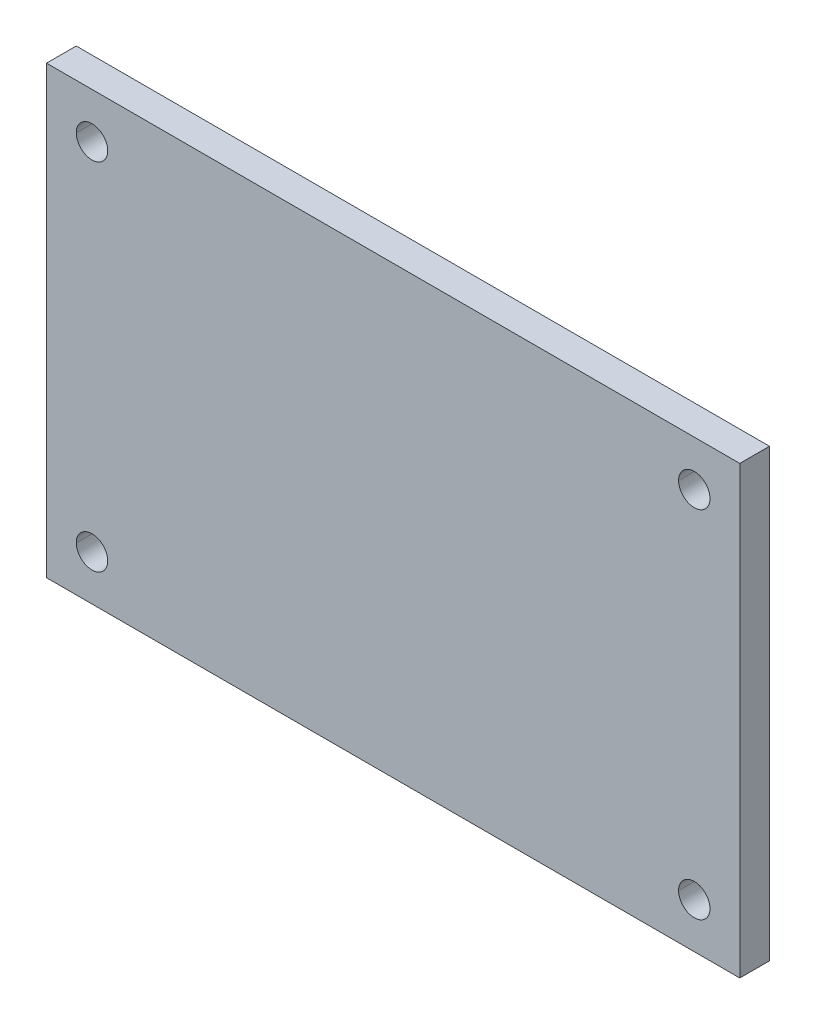
ISO-10303-21;
HEADER;
FILE_DESCRIPTION(('STEP AP214'),'2;1');
FILE_NAME('part.step','',(''),(''),'','','');
FILE_SCHEMA(('AUTOMOTIVE_DESIGN { 1 0 10303 214 1 1 1 1 }'));
ENDSEC;
DATA;
#1=APPLICATION_CONTEXT('core data for automotive mechanical design processes');
#2=APPLICATION_PROTOCOL_DEFINITION('international standard','automotive_design',2000,#1);
#3=PRODUCT_CONTEXT('',#1,'mechanical');
#4=PRODUCT('Part','Part','',(#3));
#5=PRODUCT_RELATED_PRODUCT_CATEGORY('part','',(#4));
#6=PRODUCT_DEFINITION_FORMATION('','',#4);
#7=PRODUCT_DEFINITION_CONTEXT('part definition',#1,'design');
#8=PRODUCT_DEFINITION('design','',#6,#7);
#9=PRODUCT_DEFINITION_SHAPE('','',#8);
#10=(LENGTH_UNIT() NAMED_UNIT(*) SI_UNIT(.MILLI.,.METRE.));
#11=(NAMED_UNIT(*) PLANE_ANGLE_UNIT() SI_UNIT($,.RADIAN.));
#12=(NAMED_UNIT(*) SI_UNIT($,.STERADIAN.) SOLID_ANGLE_UNIT());
#13=UNCERTAINTY_MEASURE_WITH_UNIT(LENGTH_MEASURE(1.E-05),#10,'distance_accuracy_value','');
#14=(GEOMETRIC_REPRESENTATION_CONTEXT(3) GLOBAL_UNCERTAINTY_ASSIGNED_CONTEXT((#13)) GLOBAL_UNIT_ASSIGNED_CONTEXT((#10,
#11,#12)) REPRESENTATION_CONTEXT('',''));
#15=CARTESIAN_POINT('',(0.,0.,0.));
#16=DIRECTION('',(0.,0.,1.));
#17=DIRECTION('',(1.,0.,0.));
#18=AXIS2_PLACEMENT_3D('',#15,#16,#17);
#19=CARTESIAN_POINT('',(35.,0.,-10.));
#20=DIRECTION('',(-1.,0.,0.));
#21=DIRECTION('',(0.,0.,1.));
#22=AXIS2_PLACEMENT_3D('',#19,#20,#21);
#23=CYLINDRICAL_SURFACE('',#22,1.7);
#24=CARTESIAN_POINT('',(3.,0.,-10.));
#25=DIRECTION('',(1.,0.,0.));
#26=DIRECTION('',(0.,0.,-1.));
#27=AXIS2_PLACEMENT_3D('',#24,#25,#26);
#28=CIRCLE('',#27,1.7);
#29=CARTESIAN_POINT('',(3.,0.,-11.7));
#30=VERTEX_POINT('',#29);
#31=EDGE_CURVE('E272',#30,#30,#28,.T.);
#32=ORIENTED_EDGE('',*,*,#31,.T.);
#33=EDGE_LOOP('',(#32));
#34=FACE_BOUND('',#33,.T.);
#35=CARTESIAN_POINT('',(0.,0.,-10.));
#36=DIRECTION('',(-1.,0.,0.));
#37=DIRECTION('',(0.,0.,1.));
#38=AXIS2_PLACEMENT_3D('',#35,#36,#37);
#39=CIRCLE('',#38,1.7);
#40=CARTESIAN_POINT('',(0.,0.,-8.3));
#41=VERTEX_POINT('',#40);
#42=EDGE_CURVE('E44',#41,#41,#39,.F.);
#43=ORIENTED_EDGE('',*,*,#42,.F.);
#44=EDGE_LOOP('',(#43));
#45=FACE_BOUND('',#44,.T.);
#46=ADVANCED_FACE('F40',(#34,#45),#23,.F.);
#47=CARTESIAN_POINT('',(0.,0.,0.));
#48=DIRECTION('',(0.,0.,1.));
#49=DIRECTION('',(1.,0.,0.));
#50=AXIS2_PLACEMENT_3D('',#47,#48,#49);
#51=PLANE('',#50);
#52=DIRECTION('',(0.,1.,0.));
#53=VECTOR('',#52,1.);
#54=CARTESIAN_POINT('',(35.,-22.5,0.));
#55=LINE('',#54,#53);
#56=CARTESIAN_POINT('',(35.,-22.5,0.));
#57=VERTEX_POINT('',#56);
#58=CARTESIAN_POINT('',(35.,22.5,0.));
#59=VERTEX_POINT('',#58);
#60=EDGE_CURVE('E175',#57,#59,#55,.T.);
#61=ORIENTED_EDGE('',*,*,#60,.F.);
#62=DIRECTION('',(1.,0.,0.));
#63=VECTOR('',#62,1.);
#64=CARTESIAN_POINT('',(35.,-22.5,0.));
#65=LINE('',#64,#63);
#66=CARTESIAN_POINT('',(-35.,-22.5,0.));
#67=VERTEX_POINT('',#66);
#68=EDGE_CURVE('E184',#67,#57,#65,.T.);
#69=ORIENTED_EDGE('',*,*,#68,.F.);
#70=DIRECTION('',(0.,-1.,0.));
#71=VECTOR('',#70,1.);
#72=CARTESIAN_POINT('',(-35.,-22.5,0.));
#73=LINE('',#72,#71);
#74=CARTESIAN_POINT('',(-35.,22.5,0.));
#75=VERTEX_POINT('',#74);
#76=EDGE_CURVE('E190',#75,#67,#73,.T.);
#77=ORIENTED_EDGE('',*,*,#76,.F.);
#78=DIRECTION('',(-1.,0.,0.));
#79=VECTOR('',#78,1.);
#80=CARTESIAN_POINT('',(35.,22.5,0.));
#81=LINE('',#80,#79);
#82=EDGE_CURVE('E195',#59,#75,#81,.T.);
#83=ORIENTED_EDGE('',*,*,#82,.F.);
#84=EDGE_LOOP('',(#61,#69,#77,#83));
#85=FACE_BOUND('',#84,.T.);
#86=CARTESIAN_POINT('',(30.4078282956525,-17.94069088138,0.));
#87=DIRECTION('',(0.,0.,1.));
#88=DIRECTION('',(1.,0.,0.));
#89=AXIS2_PLACEMENT_3D('',#86,#87,#88);
#90=CIRCLE('',#89,1.58750520701328);
#91=CARTESIAN_POINT('',(28.8203230886392,-17.94069088138,0.));
#92=VERTEX_POINT('',#91);
#93=CARTESIAN_POINT('',(31.9953335026658,-17.94069088138,0.));
#94=VERTEX_POINT('',#93);
#95=EDGE_CURVE('E212',#92,#94,#90,.T.);
#96=ORIENTED_EDGE('',*,*,#95,.T.);
#97=CARTESIAN_POINT('',(30.4078282956525,-17.94069088138,0.));
#98=DIRECTION('',(0.,0.,1.));
#99=DIRECTION('',(1.,0.,0.));
#100=AXIS2_PLACEMENT_3D('',#97,#98,#99);
#101=CIRCLE('',#100,1.58750520701328);
#102=EDGE_CURVE('E225',#94,#92,#101,.T.);
#103=ORIENTED_EDGE('',*,*,#102,.T.);
#104=EDGE_LOOP('',(#96,#103));
#105=FACE_BOUND('',#104,.T.);
#106=CARTESIAN_POINT('',(30.4078282956525,17.91656083312,0.));
#107=DIRECTION('',(0.,0.,1.));
#108=DIRECTION('',(1.,0.,0.));
#109=AXIS2_PLACEMENT_3D('',#106,#107,#108);
#110=CIRCLE('',#109,1.58750520701328);
#111=CARTESIAN_POINT('',(28.8203230886392,17.91656083312,0.));
#112=VERTEX_POINT('',#111);
#113=CARTESIAN_POINT('',(31.9953335026658,17.91656083312,0.));
#114=VERTEX_POINT('',#113);
#115=EDGE_CURVE('E243',#112,#114,#110,.T.);
#116=ORIENTED_EDGE('',*,*,#115,.T.);
#117=CARTESIAN_POINT('',(30.4078282956525,17.91656083312,0.));
#118=DIRECTION('',(0.,0.,1.));
#119=DIRECTION('',(1.,0.,0.));
#120=AXIS2_PLACEMENT_3D('',#117,#118,#119);
#121=CIRCLE('',#120,1.58750520701328);
#122=EDGE_CURVE('E221',#114,#112,#121,.T.);
#123=ORIENTED_EDGE('',*,*,#122,.T.);
#124=EDGE_LOOP('',(#116,#123));
#125=FACE_BOUND('',#124,.T.);
#126=CARTESIAN_POINT('',(-30.4078282956525,-17.94069088138,0.));
#127=DIRECTION('',(0.,0.,1.));
#128=DIRECTION('',(-1.,0.,0.));
#129=AXIS2_PLACEMENT_3D('',#126,#127,#128);
#130=CIRCLE('',#129,1.58750520701333);
#131=CARTESIAN_POINT('',(-31.9953335026658,-17.94069088138,0.));
#132=VERTEX_POINT('',#131);
#133=CARTESIAN_POINT('',(-28.8203230886392,-17.94069088138,0.));
#134=VERTEX_POINT('',#133);
#135=EDGE_CURVE('E214',#132,#134,#130,.T.);
#136=ORIENTED_EDGE('',*,*,#135,.T.);
#137=CARTESIAN_POINT('',(-30.4078282956525,-17.94069088138,0.));
#138=DIRECTION('',(0.,0.,1.));
#139=DIRECTION('',(-1.,0.,0.));
#140=AXIS2_PLACEMENT_3D('',#137,#138,#139);
#141=CIRCLE('',#140,1.58750520701333);
#142=EDGE_CURVE('E154',#134,#132,#141,.T.);
#143=ORIENTED_EDGE('',*,*,#142,.T.);
#144=EDGE_LOOP('',(#136,#143));
#145=FACE_BOUND('',#144,.T.);
#146=CARTESIAN_POINT('',(-30.4078282956525,17.91656083312,0.));
#147=DIRECTION('',(0.,0.,1.));
#148=DIRECTION('',(-1.,0.,0.));
#149=AXIS2_PLACEMENT_3D('',#146,#147,#148);
#150=CIRCLE('',#149,1.58750520701334);
#151=CARTESIAN_POINT('',(-31.9953335026658,17.91656083312,0.));
#152=VERTEX_POINT('',#151);
#153=CARTESIAN_POINT('',(-28.8203230886392,17.91656083312,0.));
#154=VERTEX_POINT('',#153);
#155=EDGE_CURVE('E253',#152,#154,#150,.T.);
#156=ORIENTED_EDGE('',*,*,#155,.T.);
#157=CARTESIAN_POINT('',(-30.4078282956525,17.91656083312,0.));
#158=DIRECTION('',(0.,0.,1.));
#159=DIRECTION('',(-1.,0.,0.));
#160=AXIS2_PLACEMENT_3D('',#157,#158,#159);
#161=CIRCLE('',#160,1.58750520701334);
#162=EDGE_CURVE('E220',#154,#152,#161,.T.);
#163=ORIENTED_EDGE('',*,*,#162,.T.);
#164=EDGE_LOOP('',(#156,#163));
#165=FACE_BOUND('',#164,.T.);
#166=DIRECTION('',(0.,-1.,0.));
#167=VECTOR('',#166,1.);
#168=CARTESIAN_POINT('',(-3.,-291575.25,0.));
#169=LINE('',#168,#167);
#170=CARTESIAN_POINT('',(-3.,9.99999999993406,0.));
#171=VERTEX_POINT('',#170);
#172=CARTESIAN_POINT('',(-3.,-9.99999999993406,-2.27373675443232E-10));
#173=VERTEX_POINT('',#172);
#174=EDGE_CURVE('E293',#171,#173,#169,.T.);
#175=ORIENTED_EDGE('',*,*,#174,.T.);
#176=DIRECTION('',(1.,0.,0.));
#177=VECTOR('',#176,1.);
#178=CARTESIAN_POINT('',(-3.,-9.99999999993406,-2.27373675443232E-10));
#179=LINE('',#178,#177);
#180=CARTESIAN_POINT('',(3.,-9.99999999993406,-2.27373675443232E-10));
#181=VERTEX_POINT('',#180);
#182=EDGE_CURVE('E315',#173,#181,#179,.T.);
#183=ORIENTED_EDGE('',*,*,#182,.T.);
#184=DIRECTION('',(0.,-1.,0.));
#185=VECTOR('',#184,1.);
#186=CARTESIAN_POINT('',(3.,-291575.25,0.));
#187=LINE('',#186,#185);
#188=CARTESIAN_POINT('',(3.,9.99999999991985,0.));
#189=VERTEX_POINT('',#188);
#190=EDGE_CURVE('E276',#189,#181,#187,.T.);
#191=ORIENTED_EDGE('',*,*,#190,.F.);
#192=DIRECTION('',(1.,0.,0.));
#193=VECTOR('',#192,1.);
#194=CARTESIAN_POINT('',(-3.,9.99999999993406,0.));
#195=LINE('',#194,#193);
#196=EDGE_CURVE('E302',#171,#189,#195,.T.);
#197=ORIENTED_EDGE('',*,*,#196,.F.);
#198=EDGE_LOOP('',(#175,#183,#191,#197));
#199=FACE_BOUND('',#198,.T.);
#200=ADVANCED_FACE('F193',(#85,#105,#125,#145,#165,#199),#51,.F.);
#201=CARTESIAN_POINT('',(-30.4078282956525,-17.94069088138,3.));
#202=DIRECTION('',(0.,0.,-1.));
#203=DIRECTION('',(-1.,0.,0.));
#204=AXIS2_PLACEMENT_3D('',#201,#202,#203);
#205=CYLINDRICAL_SURFACE('',#204,1.58750520701333);
#206=DIRECTION('',(0.,0.,-1.));
#207=VECTOR('',#206,1.);
#208=CARTESIAN_POINT('',(-28.8203230886392,-17.94069088138,3.));
#209=LINE('',#208,#207);
#210=CARTESIAN_POINT('',(-28.8203230886392,-17.94069088138,3.));
#211=VERTEX_POINT('',#210);
#212=EDGE_CURVE('E218',#211,#134,#209,.T.);
#213=ORIENTED_EDGE('',*,*,#212,.F.);
#214=CARTESIAN_POINT('',(-30.4078282956525,-17.94069088138,3.));
#215=DIRECTION('',(0.,0.,1.));
#216=DIRECTION('',(-1.,0.,0.));
#217=AXIS2_PLACEMENT_3D('',#214,#215,#216);
#218=CIRCLE('',#217,1.58750520701333);
#219=CARTESIAN_POINT('',(-31.9953335026658,-17.94069088138,3.));
#220=VERTEX_POINT('',#219);
#221=EDGE_CURVE('E197',#211,#220,#218,.T.);
#222=ORIENTED_EDGE('',*,*,#221,.T.);
#223=DIRECTION('',(0.,0.,-1.));
#224=VECTOR('',#223,1.);
#225=CARTESIAN_POINT('',(-31.9953335026658,-17.94069088138,3.));
#226=LINE('',#225,#224);
#227=EDGE_CURVE('E217',#220,#132,#226,.T.);
#228=ORIENTED_EDGE('',*,*,#227,.T.);
#229=ORIENTED_EDGE('',*,*,#142,.F.);
#230=EDGE_LOOP('',(#213,#222,#228,#229));
#231=FACE_BOUND('',#230,.T.);
#232=ADVANCED_FACE('F361',(#231),#205,.F.);
#233=CARTESIAN_POINT('',(-30.4078282956525,17.91656083312,3.));
#234=DIRECTION('',(0.,0.,-1.));
#235=DIRECTION('',(-1.,0.,0.));
#236=AXIS2_PLACEMENT_3D('',#233,#234,#235);
#237=CYLINDRICAL_SURFACE('',#236,1.58750520701334);
#238=DIRECTION('',(0.,0.,-1.));
#239=VECTOR('',#238,1.);
#240=CARTESIAN_POINT('',(-28.8203230886392,17.91656083312,3.));
#241=LINE('',#240,#239);
#242=CARTESIAN_POINT('',(-28.8203230886392,17.91656083312,3.));
#243=VERTEX_POINT('',#242);
#244=EDGE_CURVE('E257',#243,#154,#241,.T.);
#245=ORIENTED_EDGE('',*,*,#244,.F.);
#246=CARTESIAN_POINT('',(-30.4078282956525,17.91656083312,3.));
#247=DIRECTION('',(0.,0.,1.));
#248=DIRECTION('',(-1.,0.,0.));
#249=AXIS2_PLACEMENT_3D('',#246,#247,#248);
#250=CIRCLE('',#249,1.58750520701334);
#251=CARTESIAN_POINT('',(-31.9953335026658,17.91656083312,3.));
#252=VERTEX_POINT('',#251);
#253=EDGE_CURVE('E145',#243,#252,#250,.T.);
#254=ORIENTED_EDGE('',*,*,#253,.T.);
#255=DIRECTION('',(0.,0.,-1.));
#256=VECTOR('',#255,1.);
#257=CARTESIAN_POINT('',(-31.9953335026658,17.91656083312,3.));
#258=LINE('',#257,#256);
#259=EDGE_CURVE('E207',#252,#152,#258,.T.);
#260=ORIENTED_EDGE('',*,*,#259,.T.);
#261=ORIENTED_EDGE('',*,*,#162,.F.);
#262=EDGE_LOOP('',(#245,#254,#260,#261));
#263=FACE_BOUND('',#262,.T.);
#264=ADVANCED_FACE('F354',(#263),#237,.F.);
#265=CARTESIAN_POINT('',(30.4078282956525,17.91656083312,3.));
#266=DIRECTION('',(0.,0.,-1.));
#267=DIRECTION('',(-1.,0.,0.));
#268=AXIS2_PLACEMENT_3D('',#265,#266,#267);
#269=CYLINDRICAL_SURFACE('',#268,1.58750520701329);
#270=DIRECTION('',(0.,0.,-1.));
#271=VECTOR('',#270,1.);
#272=CARTESIAN_POINT('',(31.9953335026658,17.91656083312,3.));
#273=LINE('',#272,#271);
#274=CARTESIAN_POINT('',(31.9953335026658,17.91656083312,3.));
#275=VERTEX_POINT('',#274);
#276=EDGE_CURVE('E240',#275,#114,#273,.T.);
#277=ORIENTED_EDGE('',*,*,#276,.F.);
#278=CARTESIAN_POINT('',(30.4078282956525,17.91656083312,3.));
#279=DIRECTION('',(0.,0.,1.));
#280=DIRECTION('',(1.,0.,0.));
#281=AXIS2_PLACEMENT_3D('',#278,#279,#280);
#282=CIRCLE('',#281,1.58750520701328);
#283=CARTESIAN_POINT('',(28.8203230886392,17.91656083312,3.));
#284=VERTEX_POINT('',#283);
#285=EDGE_CURVE('E203',#275,#284,#282,.T.);
#286=ORIENTED_EDGE('',*,*,#285,.T.);
#287=DIRECTION('',(0.,0.,-1.));
#288=VECTOR('',#287,1.);
#289=CARTESIAN_POINT('',(28.8203230886392,17.91656083312,3.));
#290=LINE('',#289,#288);
#291=EDGE_CURVE('E247',#284,#112,#290,.T.);
#292=ORIENTED_EDGE('',*,*,#291,.T.);
#293=ORIENTED_EDGE('',*,*,#122,.F.);
#294=EDGE_LOOP('',(#277,#286,#292,#293));
#295=FACE_BOUND('',#294,.T.);
#296=ADVANCED_FACE('F465',(#295),#269,.F.);
#297=CARTESIAN_POINT('',(30.4078282956525,-17.94069088138,3.));
#298=DIRECTION('',(0.,0.,-1.));
#299=DIRECTION('',(-1.,0.,0.));
#300=AXIS2_PLACEMENT_3D('',#297,#298,#299);
#301=CYLINDRICAL_SURFACE('',#300,1.58750520701328);
#302=DIRECTION('',(0.,0.,-1.));
#303=VECTOR('',#302,1.);
#304=CARTESIAN_POINT('',(31.9953335026658,-17.94069088138,3.));
#305=LINE('',#304,#303);
#306=CARTESIAN_POINT('',(31.9953335026658,-17.94069088138,3.));
#307=VERTEX_POINT('',#306);
#308=EDGE_CURVE('E209',#307,#94,#305,.T.);
#309=ORIENTED_EDGE('',*,*,#308,.F.);
#310=CARTESIAN_POINT('',(30.4078282956525,-17.94069088138,3.));
#311=DIRECTION('',(0.,0.,1.));
#312=DIRECTION('',(1.,0.,0.));
#313=AXIS2_PLACEMENT_3D('',#310,#311,#312);
#314=CIRCLE('',#313,1.58750520701328);
#315=CARTESIAN_POINT('',(28.8203230886392,-17.94069088138,3.));
#316=VERTEX_POINT('',#315);
#317=EDGE_CURVE('E332',#307,#316,#314,.T.);
#318=ORIENTED_EDGE('',*,*,#317,.T.);
#319=DIRECTION('',(0.,0.,-1.));
#320=VECTOR('',#319,1.);
#321=CARTESIAN_POINT('',(28.8203230886392,-17.94069088138,3.));
#322=LINE('',#321,#320);
#323=EDGE_CURVE('E264',#316,#92,#322,.T.);
#324=ORIENTED_EDGE('',*,*,#323,.T.);
#325=ORIENTED_EDGE('',*,*,#102,.F.);
#326=EDGE_LOOP('',(#309,#318,#324,#325));
#327=FACE_BOUND('',#326,.T.);
#328=ADVANCED_FACE('F399',(#327),#301,.F.);
#329=CARTESIAN_POINT('',(35.,22.5,3.));
#330=DIRECTION('',(0.,-1.,0.));
#331=DIRECTION('',(0.,0.,-1.));
#332=AXIS2_PLACEMENT_3D('',#329,#330,#331);
#333=PLANE('',#332);
#334=ORIENTED_EDGE('',*,*,#82,.T.);
#335=DIRECTION('',(0.,0.,-1.));
#336=VECTOR('',#335,1.);
#337=CARTESIAN_POINT('',(-35.,22.5,3.));
#338=LINE('',#337,#336);
#339=CARTESIAN_POINT('',(-35.,22.5,3.));
#340=VERTEX_POINT('',#339);
#341=EDGE_CURVE('E71',#340,#75,#338,.T.);
#342=ORIENTED_EDGE('',*,*,#341,.F.);
#343=DIRECTION('',(-1.,0.,0.));
#344=VECTOR('',#343,1.);
#345=CARTESIAN_POINT('',(35.,22.5,3.));
#346=LINE('',#345,#344);
#347=CARTESIAN_POINT('',(35.,22.5,3.));
#348=VERTEX_POINT('',#347);
#349=EDGE_CURVE('E230',#348,#340,#346,.T.);
#350=ORIENTED_EDGE('',*,*,#349,.F.);
#351=DIRECTION('',(0.,0.,-1.));
#352=VECTOR('',#351,1.);
#353=CARTESIAN_POINT('',(35.,22.5,3.));
#354=LINE('',#353,#352);
#355=EDGE_CURVE('E11',#348,#59,#354,.T.);
#356=ORIENTED_EDGE('',*,*,#355,.T.);
#357=EDGE_LOOP('',(#334,#342,#350,#356));
#358=FACE_BOUND('',#357,.T.);
#359=ADVANCED_FACE('F444',(#358),#333,.F.);
#360=CARTESIAN_POINT('',(35.,-22.5,3.));
#361=DIRECTION('',(-1.,0.,0.));
#362=DIRECTION('',(0.,0.,1.));
#363=AXIS2_PLACEMENT_3D('',#360,#361,#362);
#364=PLANE('',#363);
#365=ORIENTED_EDGE('',*,*,#60,.T.);
#366=ORIENTED_EDGE('',*,*,#355,.F.);
#367=DIRECTION('',(0.,1.,0.));
#368=VECTOR('',#367,1.);
#369=CARTESIAN_POINT('',(35.,-22.5,3.));
#370=LINE('',#369,#368);
#371=CARTESIAN_POINT('',(35.,-22.5,3.));
#372=VERTEX_POINT('',#371);
#373=EDGE_CURVE('E177',#372,#348,#370,.T.);
#374=ORIENTED_EDGE('',*,*,#373,.F.);
#375=DIRECTION('',(0.,0.,-1.));
#376=VECTOR('',#375,1.);
#377=CARTESIAN_POINT('',(35.,-22.5,3.));
#378=LINE('',#377,#376);
#379=EDGE_CURVE('E50',#372,#57,#378,.T.);
#380=ORIENTED_EDGE('',*,*,#379,.T.);
#381=EDGE_LOOP('',(#365,#366,#374,#380));
#382=FACE_BOUND('',#381,.T.);
#383=ADVANCED_FACE('F173',(#382),#364,.F.);
#384=CARTESIAN_POINT('',(35.,-22.5,3.));
#385=DIRECTION('',(0.,1.,0.));
#386=DIRECTION('',(1.,0.,0.));
#387=AXIS2_PLACEMENT_3D('',#384,#385,#386);
#388=PLANE('',#387);
#389=ORIENTED_EDGE('',*,*,#68,.T.);
#390=ORIENTED_EDGE('',*,*,#379,.F.);
#391=DIRECTION('',(1.,0.,0.));
#392=VECTOR('',#391,1.);
#393=CARTESIAN_POINT('',(35.,-22.5,3.));
#394=LINE('',#393,#392);
#395=CARTESIAN_POINT('',(-35.,-22.5,3.));
#396=VERTEX_POINT('',#395);
#397=EDGE_CURVE('E226',#396,#372,#394,.T.);
#398=ORIENTED_EDGE('',*,*,#397,.F.);
#399=DIRECTION('',(0.,0.,-1.));
#400=VECTOR('',#399,1.);
#401=CARTESIAN_POINT('',(-35.,-22.5,3.));
#402=LINE('',#401,#400);
#403=EDGE_CURVE('E186',#396,#67,#402,.T.);
#404=ORIENTED_EDGE('',*,*,#403,.T.);
#405=EDGE_LOOP('',(#389,#390,#398,#404));
#406=FACE_BOUND('',#405,.T.);
#407=ADVANCED_FACE('F42',(#406),#388,.F.);
#408=CARTESIAN_POINT('',(-35.,-22.5,3.));
#409=DIRECTION('',(1.,0.,0.));
#410=DIRECTION('',(0.,1.,0.));
#411=AXIS2_PLACEMENT_3D('',#408,#409,#410);
#412=PLANE('',#411);
#413=ORIENTED_EDGE('',*,*,#76,.T.);
#414=ORIENTED_EDGE('',*,*,#403,.F.);
#415=DIRECTION('',(0.,-1.,0.));
#416=VECTOR('',#415,1.);
#417=CARTESIAN_POINT('',(-35.,-22.5,3.));
#418=LINE('',#417,#416);
#419=EDGE_CURVE('E229',#340,#396,#418,.T.);
#420=ORIENTED_EDGE('',*,*,#419,.F.);
#421=ORIENTED_EDGE('',*,*,#341,.T.);
#422=EDGE_LOOP('',(#413,#414,#420,#421));
#423=FACE_BOUND('',#422,.T.);
#424=ADVANCED_FACE('F407',(#423),#412,.F.);
#425=CARTESIAN_POINT('',(0.,0.,3.));
#426=DIRECTION('',(0.,0.,1.));
#427=DIRECTION('',(1.,0.,0.));
#428=AXIS2_PLACEMENT_3D('',#425,#426,#427);
#429=PLANE('',#428);
#430=CARTESIAN_POINT('',(-30.4078282956525,-17.94069088138,3.));
#431=DIRECTION('',(0.,0.,1.));
#432=DIRECTION('',(-1.,0.,0.));
#433=AXIS2_PLACEMENT_3D('',#430,#431,#432);
#434=CIRCLE('',#433,1.58750520701333);
#435=EDGE_CURVE('E271',#220,#211,#434,.T.);
#436=ORIENTED_EDGE('',*,*,#435,.F.);
#437=ORIENTED_EDGE('',*,*,#221,.F.);
#438=EDGE_LOOP('',(#436,#437));
#439=FACE_BOUND('',#438,.T.);
#440=CARTESIAN_POINT('',(30.4078282956525,17.91656083312,3.));
#441=DIRECTION('',(0.,0.,1.));
#442=DIRECTION('',(1.,0.,0.));
#443=AXIS2_PLACEMENT_3D('',#440,#441,#442);
#444=CIRCLE('',#443,1.58750520701328);
#445=EDGE_CURVE('E236',#284,#275,#444,.T.);
#446=ORIENTED_EDGE('',*,*,#445,.F.);
#447=ORIENTED_EDGE('',*,*,#285,.F.);
#448=EDGE_LOOP('',(#446,#447));
#449=FACE_BOUND('',#448,.T.);
#450=CARTESIAN_POINT('',(30.4078282956525,-17.94069088138,3.));
#451=DIRECTION('',(0.,0.,1.));
#452=DIRECTION('',(1.,0.,0.));
#453=AXIS2_PLACEMENT_3D('',#450,#451,#452);
#454=CIRCLE('',#453,1.58750520701328);
#455=EDGE_CURVE('E213',#316,#307,#454,.T.);
#456=ORIENTED_EDGE('',*,*,#455,.F.);
#457=ORIENTED_EDGE('',*,*,#317,.F.);
#458=EDGE_LOOP('',(#456,#457));
#459=FACE_BOUND('',#458,.T.);
#460=CARTESIAN_POINT('',(-30.4078282956525,17.91656083312,3.));
#461=DIRECTION('',(0.,0.,1.));
#462=DIRECTION('',(-1.,0.,0.));
#463=AXIS2_PLACEMENT_3D('',#460,#461,#462);
#464=CIRCLE('',#463,1.58750520701334);
#465=EDGE_CURVE('E268',#252,#243,#464,.T.);
#466=ORIENTED_EDGE('',*,*,#465,.F.);
#467=ORIENTED_EDGE('',*,*,#253,.F.);
#468=EDGE_LOOP('',(#466,#467));
#469=FACE_BOUND('',#468,.T.);
#470=ORIENTED_EDGE('',*,*,#419,.T.);
#471=ORIENTED_EDGE('',*,*,#397,.T.);
#472=ORIENTED_EDGE('',*,*,#373,.T.);
#473=ORIENTED_EDGE('',*,*,#349,.T.);
#474=EDGE_LOOP('',(#470,#471,#472,#473));
#475=FACE_BOUND('',#474,.T.);
#476=ADVANCED_FACE('F404',(#439,#449,#459,#469,#475),#429,.T.);
#477=CARTESIAN_POINT('',(30.4078282956525,-17.94069088138,3.));
#478=DIRECTION('',(0.,0.,-1.));
#479=DIRECTION('',(-1.,0.,0.));
#480=AXIS2_PLACEMENT_3D('',#477,#478,#479);
#481=CYLINDRICAL_SURFACE('',#480,1.58750520701328);
#482=ORIENTED_EDGE('',*,*,#455,.T.);
#483=ORIENTED_EDGE('',*,*,#308,.T.);
#484=ORIENTED_EDGE('',*,*,#95,.F.);
#485=ORIENTED_EDGE('',*,*,#323,.F.);
#486=EDGE_LOOP('',(#482,#483,#484,#485));
#487=FACE_BOUND('',#486,.T.);
#488=ADVANCED_FACE('F402',(#487),#481,.F.);
#489=CARTESIAN_POINT('',(30.4078282956525,17.91656083312,3.));
#490=DIRECTION('',(0.,0.,-1.));
#491=DIRECTION('',(-1.,0.,0.));
#492=AXIS2_PLACEMENT_3D('',#489,#490,#491);
#493=CYLINDRICAL_SURFACE('',#492,1.58750520701329);
#494=ORIENTED_EDGE('',*,*,#445,.T.);
#495=ORIENTED_EDGE('',*,*,#276,.T.);
#496=ORIENTED_EDGE('',*,*,#115,.F.);
#497=ORIENTED_EDGE('',*,*,#291,.F.);
#498=EDGE_LOOP('',(#494,#495,#496,#497));
#499=FACE_BOUND('',#498,.T.);
#500=ADVANCED_FACE('F450',(#499),#493,.F.);
#501=CARTESIAN_POINT('',(-30.4078282956525,17.91656083312,3.));
#502=DIRECTION('',(0.,0.,-1.));
#503=DIRECTION('',(-1.,0.,0.));
#504=AXIS2_PLACEMENT_3D('',#501,#502,#503);
#505=CYLINDRICAL_SURFACE('',#504,1.58750520701334);
#506=ORIENTED_EDGE('',*,*,#465,.T.);
#507=ORIENTED_EDGE('',*,*,#244,.T.);
#508=ORIENTED_EDGE('',*,*,#155,.F.);
#509=ORIENTED_EDGE('',*,*,#259,.F.);
#510=EDGE_LOOP('',(#506,#507,#508,#509));
#511=FACE_BOUND('',#510,.T.);
#512=ADVANCED_FACE('F357',(#511),#505,.F.);
#513=CARTESIAN_POINT('',(-30.4078282956525,-17.94069088138,3.));
#514=DIRECTION('',(0.,0.,-1.));
#515=DIRECTION('',(-1.,0.,0.));
#516=AXIS2_PLACEMENT_3D('',#513,#514,#515);
#517=CYLINDRICAL_SURFACE('',#516,1.58750520701333);
#518=ORIENTED_EDGE('',*,*,#435,.T.);
#519=ORIENTED_EDGE('',*,*,#212,.T.);
#520=ORIENTED_EDGE('',*,*,#135,.F.);
#521=ORIENTED_EDGE('',*,*,#227,.F.);
#522=EDGE_LOOP('',(#518,#519,#520,#521));
#523=FACE_BOUND('',#522,.T.);
#524=ADVANCED_FACE('F443',(#523),#517,.F.);
#525=CARTESIAN_POINT('',(-3.,101320.160348483,186047.232617408));
#526=DIRECTION('',(0.,0.878232998312527,-0.478232998312527));
#527=DIRECTION('',(0.,0.478232998312527,0.878232998312527));
#528=AXIS2_PLACEMENT_3D('',#525,#526,#527);
#529=PLANE('',#528);
#530=DIRECTION('',(0.,0.478232998312527,0.878232998312527));
#531=VECTOR('',#530,1.);
#532=CARTESIAN_POINT('',(3.,101320.160348483,186047.232617408));
#533=LINE('',#532,#531);
#534=CARTESIAN_POINT('',(3.,3.51293199319203,-11.9129319933567));
#535=VERTEX_POINT('',#534);
#536=EDGE_CURVE('E58',#535,#189,#533,.T.);
#537=ORIENTED_EDGE('',*,*,#536,.F.);
#538=DIRECTION('',(1.,0.,0.));
#539=VECTOR('',#538,1.);
#540=CARTESIAN_POINT('',(-3.,3.51293199319203,-11.9129319933567));
#541=LINE('',#540,#539);
#542=CARTESIAN_POINT('',(-3.,3.51293199319203,-11.9129319933567));
#543=VERTEX_POINT('',#542);
#544=EDGE_CURVE('E309',#543,#535,#541,.T.);
#545=ORIENTED_EDGE('',*,*,#544,.F.);
#546=DIRECTION('',(0.,0.478232998312527,0.878232998312527));
#547=VECTOR('',#546,1.);
#548=CARTESIAN_POINT('',(-3.,101320.160348483,186047.232617408));
#549=LINE('',#548,#547);
#550=EDGE_CURVE('E290',#543,#171,#549,.T.);
#551=ORIENTED_EDGE('',*,*,#550,.T.);
#552=ORIENTED_EDGE('',*,*,#196,.T.);
#553=EDGE_LOOP('',(#537,#545,#551,#552));
#554=FACE_BOUND('',#553,.T.);
#555=ADVANCED_FACE('F381',(#554),#529,.T.);
#556=CARTESIAN_POINT('',(-3.,0.,-10.));
#557=DIRECTION('',(1.,0.,0.));
#558=DIRECTION('',(0.,0.,-1.));
#559=AXIS2_PLACEMENT_3D('',#556,#557,#558);
#560=CYLINDRICAL_SURFACE('',#559,3.99999999999999);
#561=CARTESIAN_POINT('',(3.,0.,-10.));
#562=DIRECTION('',(1.,0.,0.));
#563=DIRECTION('',(0.,0.,-1.));
#564=AXIS2_PLACEMENT_3D('',#561,#562,#563);
#565=CIRCLE('',#564,3.99999999999999);
#566=CARTESIAN_POINT('',(3.,-3.51293199318766,-11.9129319933648));
#567=VERTEX_POINT('',#566);
#568=EDGE_CURVE('E294',#567,#535,#565,.T.);
#569=ORIENTED_EDGE('',*,*,#568,.F.);
#570=DIRECTION('',(1.,0.,0.));
#571=VECTOR('',#570,1.);
#572=CARTESIAN_POINT('',(-3.,-3.51293199318766,-11.9129319933648));
#573=LINE('',#572,#571);
#574=CARTESIAN_POINT('',(-3.,-3.51293199318766,-11.9129319933648));
#575=VERTEX_POINT('',#574);
#576=EDGE_CURVE('E312',#575,#567,#573,.T.);
#577=ORIENTED_EDGE('',*,*,#576,.F.);
#578=CARTESIAN_POINT('',(-3.,0.,-10.));
#579=DIRECTION('',(1.,0.,0.));
#580=DIRECTION('',(0.,0.,-1.));
#581=AXIS2_PLACEMENT_3D('',#578,#579,#580);
#582=CIRCLE('',#581,3.99999999999999);
#583=EDGE_CURVE('E300',#575,#543,#582,.T.);
#584=ORIENTED_EDGE('',*,*,#583,.T.);
#585=ORIENTED_EDGE('',*,*,#544,.T.);
#586=EDGE_LOOP('',(#569,#577,#584,#585));
#587=FACE_BOUND('',#586,.T.);
#588=ADVANCED_FACE('F385',(#587),#560,.T.);
#589=CARTESIAN_POINT('',(-3.,-234690.645515504,430970.442617408));
#590=DIRECTION('',(0.,-0.878232998312527,-0.478232998312527));
#591=DIRECTION('',(0.,0.478232998312527,-0.878232998312527));
#592=AXIS2_PLACEMENT_3D('',#589,#590,#591);
#593=PLANE('',#592);
#594=DIRECTION('',(0.,0.478232998312527,-0.878232998312527));
#595=VECTOR('',#594,1.);
#596=CARTESIAN_POINT('',(3.,-234690.645515504,430970.442617408));
#597=LINE('',#596,#595);
#598=EDGE_CURVE('E305',#181,#567,#597,.T.);
#599=ORIENTED_EDGE('',*,*,#598,.F.);
#600=ORIENTED_EDGE('',*,*,#182,.F.);
#601=DIRECTION('',(0.,0.478232998312527,-0.878232998312527));
#602=VECTOR('',#601,1.);
#603=CARTESIAN_POINT('',(-3.,-234690.645515504,430970.442617408));
#604=LINE('',#603,#602);
#605=EDGE_CURVE('E297',#173,#575,#604,.T.);
#606=ORIENTED_EDGE('',*,*,#605,.T.);
#607=ORIENTED_EDGE('',*,*,#576,.T.);
#608=EDGE_LOOP('',(#599,#600,#606,#607));
#609=FACE_BOUND('',#608,.T.);
#610=ADVANCED_FACE('F430',(#609),#593,.T.);
#611=CARTESIAN_POINT('',(-3.,0.,-10.));
#612=DIRECTION('',(1.,0.,0.));
#613=DIRECTION('',(0.,0.,-1.));
#614=AXIS2_PLACEMENT_3D('',#611,#612,#613);
#615=PLANE('',#614);
#616=CARTESIAN_POINT('',(-3.,0.,-10.));
#617=DIRECTION('',(-1.,0.,0.));
#618=DIRECTION('',(0.,0.,1.));
#619=AXIS2_PLACEMENT_3D('',#616,#617,#618);
#620=CIRCLE('',#619,2.95);
#621=CARTESIAN_POINT('',(-3.,0.,-7.05));
#622=VERTEX_POINT('',#621);
#623=EDGE_CURVE('E283',#622,#622,#620,.T.);
#624=ORIENTED_EDGE('',*,*,#623,.F.);
#625=EDGE_LOOP('',(#624));
#626=FACE_BOUND('',#625,.T.);
#627=ORIENTED_EDGE('',*,*,#550,.F.);
#628=ORIENTED_EDGE('',*,*,#583,.F.);
#629=ORIENTED_EDGE('',*,*,#605,.F.);
#630=ORIENTED_EDGE('',*,*,#174,.F.);
#631=EDGE_LOOP('',(#627,#628,#629,#630));
#632=FACE_BOUND('',#631,.T.);
#633=ADVANCED_FACE('F375',(#626,#632),#615,.F.);
#634=CARTESIAN_POINT('',(3.,0.,-10.));
#635=DIRECTION('',(1.,0.,0.));
#636=DIRECTION('',(0.,0.,-1.));
#637=AXIS2_PLACEMENT_3D('',#634,#635,#636);
#638=PLANE('',#637);
#639=ORIENTED_EDGE('',*,*,#31,.F.);
#640=EDGE_LOOP('',(#639));
#641=FACE_BOUND('',#640,.T.);
#642=ORIENTED_EDGE('',*,*,#536,.T.);
#643=ORIENTED_EDGE('',*,*,#190,.T.);
#644=ORIENTED_EDGE('',*,*,#598,.T.);
#645=ORIENTED_EDGE('',*,*,#568,.T.);
#646=EDGE_LOOP('',(#642,#643,#644,#645));
#647=FACE_BOUND('',#646,.T.);
#648=ADVANCED_FACE('F429',(#641,#647),#638,.T.);
#649=CARTESIAN_POINT('',(0.,0.,-10.));
#650=DIRECTION('',(-1.,0.,0.));
#651=DIRECTION('',(0.,0.,1.));
#652=AXIS2_PLACEMENT_3D('',#649,#650,#651);
#653=PLANE('',#652);
#654=CARTESIAN_POINT('',(0.,0.,-10.));
#655=DIRECTION('',(-1.,0.,0.));
#656=DIRECTION('',(0.,0.,1.));
#657=AXIS2_PLACEMENT_3D('',#654,#655,#656);
#658=CIRCLE('',#657,2.95);
#659=CARTESIAN_POINT('',(0.,0.,-7.05));
#660=VERTEX_POINT('',#659);
#661=EDGE_CURVE('E279',#660,#660,#658,.T.);
#662=ORIENTED_EDGE('',*,*,#661,.T.);
#663=EDGE_LOOP('',(#662));
#664=FACE_BOUND('',#663,.T.);
#665=ORIENTED_EDGE('',*,*,#42,.T.);
#666=EDGE_LOOP('',(#665));
#667=FACE_BOUND('',#666,.T.);
#668=ADVANCED_FACE('F434',(#664,#667),#653,.T.);
#669=CARTESIAN_POINT('',(0.,0.,-10.));
#670=DIRECTION('',(-1.,0.,0.));
#671=DIRECTION('',(0.,0.,1.));
#672=AXIS2_PLACEMENT_3D('',#669,#670,#671);
#673=CYLINDRICAL_SURFACE('',#672,2.95);
#674=ORIENTED_EDGE('',*,*,#661,.F.);
#675=EDGE_LOOP('',(#674));
#676=FACE_BOUND('',#675,.T.);
#677=ORIENTED_EDGE('',*,*,#623,.T.);
#678=EDGE_LOOP('',(#677));
#679=FACE_BOUND('',#678,.T.);
#680=ADVANCED_FACE('F425',(#676,#679),#673,.F.);
#681=CLOSED_SHELL('',(#46,#200,#232,#264,#296,#328,#359,#383,#407,#424,#476,#488,#500,#512,#524,
#555,#588,#610,#633,#648,#668,#680));
#682=MANIFOLD_SOLID_BREP('B2',#681);
#683=ADVANCED_BREP_SHAPE_REPRESENTATION('',(#18,#682),#14);
#684=SHAPE_DEFINITION_REPRESENTATION(#9,#683);
ENDSEC;
END-ISO-10303-21;
